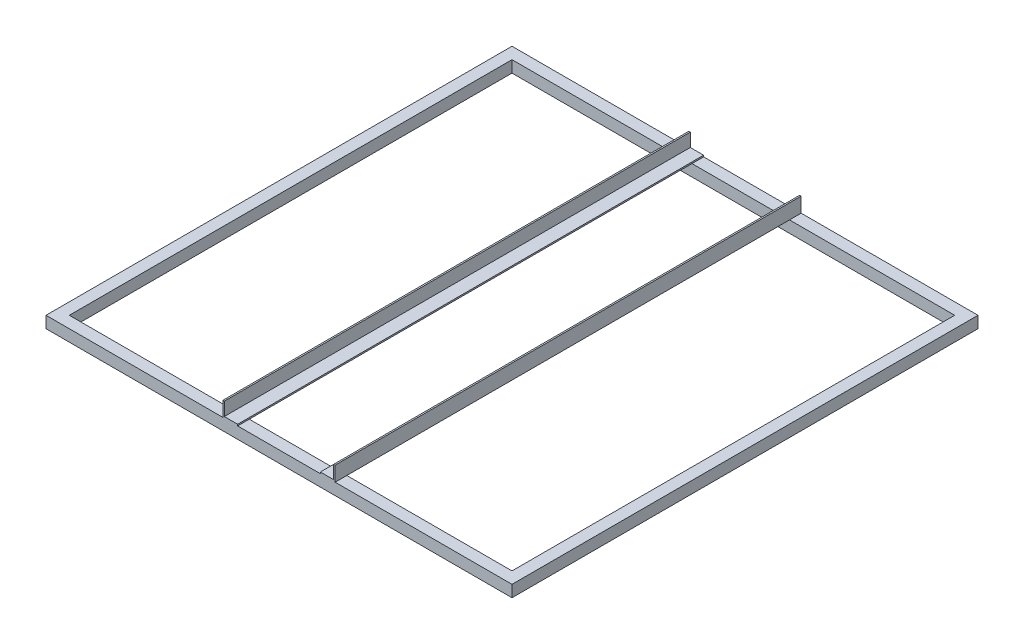
ISO-10303-21;
HEADER;
FILE_DESCRIPTION(('STEP AP214'),'2;1');
FILE_NAME('part.step','',(''),(''),'','','');
FILE_SCHEMA(('AUTOMOTIVE_DESIGN { 1 0 10303 214 1 1 1 1 }'));
ENDSEC;
DATA;
#1=APPLICATION_CONTEXT('core data for automotive mechanical design processes');
#2=APPLICATION_PROTOCOL_DEFINITION('international standard','automotive_design',2000,#1);
#3=PRODUCT_CONTEXT('',#1,'mechanical');
#4=PRODUCT('Part','Part','',(#3));
#5=PRODUCT_RELATED_PRODUCT_CATEGORY('part','',(#4));
#6=PRODUCT_DEFINITION_FORMATION('','',#4);
#7=PRODUCT_DEFINITION_CONTEXT('part definition',#1,'design');
#8=PRODUCT_DEFINITION('design','',#6,#7);
#9=PRODUCT_DEFINITION_SHAPE('','',#8);
#10=(LENGTH_UNIT() NAMED_UNIT(*) SI_UNIT(.MILLI.,.METRE.));
#11=(NAMED_UNIT(*) PLANE_ANGLE_UNIT() SI_UNIT($,.RADIAN.));
#12=(NAMED_UNIT(*) SI_UNIT($,.STERADIAN.) SOLID_ANGLE_UNIT());
#13=UNCERTAINTY_MEASURE_WITH_UNIT(LENGTH_MEASURE(1.E-05),#10,'distance_accuracy_value','');
#14=(GEOMETRIC_REPRESENTATION_CONTEXT(3) GLOBAL_UNCERTAINTY_ASSIGNED_CONTEXT((#13)) GLOBAL_UNIT_ASSIGNED_CONTEXT((#10,
#11,#12)) REPRESENTATION_CONTEXT('',''));
#15=CARTESIAN_POINT('',(0.,0.,0.));
#16=DIRECTION('',(0.,0.,1.));
#17=DIRECTION('',(1.,0.,0.));
#18=AXIS2_PLACEMENT_3D('',#15,#16,#17);
#19=CARTESIAN_POINT('',(0.,22.5,0.));
#20=DIRECTION('',(0.,-1.,0.));
#21=DIRECTION('',(0.,0.,-1.));
#22=AXIS2_PLACEMENT_3D('',#19,#20,#21);
#23=PLANE('',#22);
#24=DIRECTION('',(0.,0.,1.));
#25=VECTOR('',#24,1.);
#26=CARTESIAN_POINT('',(93.9,22.5,400.));
#27=LINE('',#26,#25);
#28=CARTESIAN_POINT('',(93.9,22.5,-400.));
#29=VERTEX_POINT('',#28);
#30=CARTESIAN_POINT('',(93.9,22.5,400.));
#31=VERTEX_POINT('',#30);
#32=EDGE_CURVE('E51',#29,#31,#27,.T.);
#33=ORIENTED_EDGE('',*,*,#32,.F.);
#34=DIRECTION('',(-1.,0.,0.));
#35=VECTOR('',#34,1.);
#36=CARTESIAN_POINT('',(71.,22.5,-400.));
#37=LINE('',#36,#35);
#38=CARTESIAN_POINT('',(71.,22.5,-400.));
#39=VERTEX_POINT('',#38);
#40=EDGE_CURVE('E254',#29,#39,#37,.T.);
#41=ORIENTED_EDGE('',*,*,#40,.T.);
#42=DIRECTION('',(0.,0.,1.));
#43=VECTOR('',#42,1.);
#44=CARTESIAN_POINT('',(71.,22.5,400.));
#45=LINE('',#44,#43);
#46=CARTESIAN_POINT('',(71.,22.5,400.));
#47=VERTEX_POINT('',#46);
#48=EDGE_CURVE('E250',#39,#47,#45,.T.);
#49=ORIENTED_EDGE('',*,*,#48,.T.);
#50=DIRECTION('',(1.,0.,0.));
#51=VECTOR('',#50,1.);
#52=CARTESIAN_POINT('',(71.,22.5,400.));
#53=LINE('',#52,#51);
#54=EDGE_CURVE('E56',#47,#31,#53,.T.);
#55=ORIENTED_EDGE('',*,*,#54,.T.);
#56=EDGE_LOOP('',(#33,#41,#49,#55));
#57=FACE_BOUND('',#56,.T.);
#58=ADVANCED_FACE('F33',(#57),#23,.F.);
#59=CARTESIAN_POINT('',(0.,22.5,0.));
#60=DIRECTION('',(0.,1.,0.));
#61=DIRECTION('',(0.,0.,1.));
#62=AXIS2_PLACEMENT_3D('',#59,#60,#61);
#63=PLANE('',#62);
#64=DIRECTION('',(-1.,0.,0.));
#65=VECTOR('',#64,1.);
#66=CARTESIAN_POINT('',(-71.,22.5,-400.));
#67=LINE('',#66,#65);
#68=CARTESIAN_POINT('',(-71.,22.5,-400.));
#69=VERTEX_POINT('',#68);
#70=CARTESIAN_POINT('',(-93.9,22.5,-400.));
#71=VERTEX_POINT('',#70);
#72=EDGE_CURVE('E272',#69,#71,#67,.T.);
#73=ORIENTED_EDGE('',*,*,#72,.T.);
#74=DIRECTION('',(0.,0.,-1.));
#75=VECTOR('',#74,1.);
#76=CARTESIAN_POINT('',(-93.9,22.5,-400.));
#77=LINE('',#76,#75);
#78=CARTESIAN_POINT('',(-93.8999999999999,22.5,400.));
#79=VERTEX_POINT('',#78);
#80=EDGE_CURVE('E230',#79,#71,#77,.T.);
#81=ORIENTED_EDGE('',*,*,#80,.F.);
#82=DIRECTION('',(1.,0.,0.));
#83=VECTOR('',#82,1.);
#84=CARTESIAN_POINT('',(-71.,22.5,400.));
#85=LINE('',#84,#83);
#86=CARTESIAN_POINT('',(-71.,22.5,400.));
#87=VERTEX_POINT('',#86);
#88=EDGE_CURVE('E275',#79,#87,#85,.T.);
#89=ORIENTED_EDGE('',*,*,#88,.T.);
#90=DIRECTION('',(0.,0.,-1.));
#91=VECTOR('',#90,1.);
#92=CARTESIAN_POINT('',(-71.,22.5,400.));
#93=LINE('',#92,#91);
#94=EDGE_CURVE('E269',#87,#69,#93,.T.);
#95=ORIENTED_EDGE('',*,*,#94,.T.);
#96=EDGE_LOOP('',(#73,#81,#89,#95));
#97=FACE_BOUND('',#96,.T.);
#98=ADVANCED_FACE('F446',(#97),#63,.T.);
#99=CARTESIAN_POINT('',(0.,20.,0.));
#100=DIRECTION('',(0.,1.,0.));
#101=DIRECTION('',(0.,0.,1.));
#102=AXIS2_PLACEMENT_3D('',#99,#100,#101);
#103=PLANE('',#102);
#104=DIRECTION('',(1.,0.,0.));
#105=VECTOR('',#104,1.);
#106=CARTESIAN_POINT('',(-400.,20.,400.));
#107=LINE('',#106,#105);
#108=CARTESIAN_POINT('',(-71.,20.,400.));
#109=VERTEX_POINT('',#108);
#110=CARTESIAN_POINT('',(71.,20.,400.));
#111=VERTEX_POINT('',#110);
#112=EDGE_CURVE('E312',#109,#111,#107,.T.);
#113=ORIENTED_EDGE('',*,*,#112,.T.);
#114=DIRECTION('',(0.,0.,1.));
#115=VECTOR('',#114,1.);
#116=CARTESIAN_POINT('',(71.,20.,400.));
#117=LINE('',#116,#115);
#118=CARTESIAN_POINT('',(71.,20.,380.));
#119=VERTEX_POINT('',#118);
#120=EDGE_CURVE('E249',#119,#111,#117,.T.);
#121=ORIENTED_EDGE('',*,*,#120,.F.);
#122=DIRECTION('',(1.,0.,0.));
#123=VECTOR('',#122,1.);
#124=CARTESIAN_POINT('',(380.,20.,380.));
#125=LINE('',#124,#123);
#126=CARTESIAN_POINT('',(-71.,20.,380.));
#127=VERTEX_POINT('',#126);
#128=EDGE_CURVE('E378',#127,#119,#125,.T.);
#129=ORIENTED_EDGE('',*,*,#128,.F.);
#130=DIRECTION('',(0.,0.,-1.));
#131=VECTOR('',#130,1.);
#132=CARTESIAN_POINT('',(-71.,20.,400.));
#133=LINE('',#132,#131);
#134=EDGE_CURVE('E281',#109,#127,#133,.T.);
#135=ORIENTED_EDGE('',*,*,#134,.F.);
#136=EDGE_LOOP('',(#113,#121,#129,#135));
#137=FACE_BOUND('',#136,.T.);
#138=ADVANCED_FACE('F401',(#137),#103,.T.);
#139=DIRECTION('',(-1.,0.,0.));
#140=VECTOR('',#139,1.);
#141=CARTESIAN_POINT('',(380.,20.,-380.));
#142=LINE('',#141,#140);
#143=CARTESIAN_POINT('',(71.,20.,-380.));
#144=VERTEX_POINT('',#143);
#145=CARTESIAN_POINT('',(-71.,20.,-380.));
#146=VERTEX_POINT('',#145);
#147=EDGE_CURVE('E364',#144,#146,#142,.T.);
#148=ORIENTED_EDGE('',*,*,#147,.F.);
#149=CARTESIAN_POINT('',(71.,20.,-400.));
#150=VERTEX_POINT('',#149);
#151=EDGE_CURVE('E256',#150,#144,#117,.T.);
#152=ORIENTED_EDGE('',*,*,#151,.F.);
#153=DIRECTION('',(-1.,0.,0.));
#154=VECTOR('',#153,1.);
#155=CARTESIAN_POINT('',(-400.,20.,-400.));
#156=LINE('',#155,#154);
#157=CARTESIAN_POINT('',(-71.,20.,-400.));
#158=VERTEX_POINT('',#157);
#159=EDGE_CURVE('E37',#150,#158,#156,.T.);
#160=ORIENTED_EDGE('',*,*,#159,.T.);
#161=EDGE_CURVE('E11',#146,#158,#133,.T.);
#162=ORIENTED_EDGE('',*,*,#161,.F.);
#163=EDGE_LOOP('',(#148,#152,#160,#162));
#164=FACE_BOUND('',#163,.T.);
#165=ADVANCED_FACE('F420',(#164),#103,.T.);
#166=CARTESIAN_POINT('',(400.,20.,-400.));
#167=VERTEX_POINT('',#166);
#168=CARTESIAN_POINT('',(96.4,20.,-400.));
#169=VERTEX_POINT('',#168);
#170=EDGE_CURVE('E329',#167,#169,#156,.T.);
#171=ORIENTED_EDGE('',*,*,#170,.T.);
#172=DIRECTION('',(0.,0.,-1.));
#173=VECTOR('',#172,1.);
#174=CARTESIAN_POINT('',(96.4,20.,400.));
#175=LINE('',#174,#173);
#176=CARTESIAN_POINT('',(96.4,20.,-380.));
#177=VERTEX_POINT('',#176);
#178=EDGE_CURVE('E202',#177,#169,#175,.T.);
#179=ORIENTED_EDGE('',*,*,#178,.F.);
#180=CARTESIAN_POINT('',(380.,20.,-380.));
#181=VERTEX_POINT('',#180);
#182=EDGE_CURVE('E348',#181,#177,#142,.T.);
#183=ORIENTED_EDGE('',*,*,#182,.F.);
#184=DIRECTION('',(0.,0.,-1.));
#185=VECTOR('',#184,1.);
#186=CARTESIAN_POINT('',(380.,20.,-380.));
#187=LINE('',#186,#185);
#188=CARTESIAN_POINT('',(380.,20.,380.));
#189=VERTEX_POINT('',#188);
#190=EDGE_CURVE('E366',#189,#181,#187,.T.);
#191=ORIENTED_EDGE('',*,*,#190,.F.);
#192=CARTESIAN_POINT('',(96.4,20.,380.));
#193=VERTEX_POINT('',#192);
#194=EDGE_CURVE('E373',#193,#189,#125,.T.);
#195=ORIENTED_EDGE('',*,*,#194,.F.);
#196=CARTESIAN_POINT('',(96.4,20.,400.));
#197=VERTEX_POINT('',#196);
#198=EDGE_CURVE('E252',#197,#193,#175,.T.);
#199=ORIENTED_EDGE('',*,*,#198,.F.);
#200=CARTESIAN_POINT('',(400.,20.,400.));
#201=VERTEX_POINT('',#200);
#202=EDGE_CURVE('E310',#197,#201,#107,.T.);
#203=ORIENTED_EDGE('',*,*,#202,.T.);
#204=DIRECTION('',(0.,0.,-1.));
#205=VECTOR('',#204,1.);
#206=CARTESIAN_POINT('',(400.,20.,-400.));
#207=LINE('',#206,#205);
#208=EDGE_CURVE('E328',#201,#167,#207,.T.);
#209=ORIENTED_EDGE('',*,*,#208,.T.);
#210=EDGE_LOOP('',(#171,#179,#183,#191,#195,#199,#203,#209));
#211=FACE_BOUND('',#210,.T.);
#212=ADVANCED_FACE('F480',(#211),#103,.T.);
#213=DIRECTION('',(0.,0.,1.));
#214=VECTOR('',#213,1.);
#215=CARTESIAN_POINT('',(-96.4,20.,400.));
#216=LINE('',#215,#214);
#217=CARTESIAN_POINT('',(-96.4,20.,-400.));
#218=VERTEX_POINT('',#217);
#219=CARTESIAN_POINT('',(-96.4,20.,-380.));
#220=VERTEX_POINT('',#219);
#221=EDGE_CURVE('E273',#218,#220,#216,.T.);
#222=ORIENTED_EDGE('',*,*,#221,.F.);
#223=CARTESIAN_POINT('',(-400.,20.,-400.));
#224=VERTEX_POINT('',#223);
#225=EDGE_CURVE('E326',#218,#224,#156,.T.);
#226=ORIENTED_EDGE('',*,*,#225,.T.);
#227=DIRECTION('',(0.,0.,1.));
#228=VECTOR('',#227,1.);
#229=CARTESIAN_POINT('',(-400.,20.,-400.));
#230=LINE('',#229,#228);
#231=CARTESIAN_POINT('',(-400.,20.,400.));
#232=VERTEX_POINT('',#231);
#233=EDGE_CURVE('E313',#224,#232,#230,.T.);
#234=ORIENTED_EDGE('',*,*,#233,.T.);
#235=CARTESIAN_POINT('',(-96.4,20.,400.));
#236=VERTEX_POINT('',#235);
#237=EDGE_CURVE('E323',#232,#236,#107,.T.);
#238=ORIENTED_EDGE('',*,*,#237,.T.);
#239=CARTESIAN_POINT('',(-96.4,20.,380.));
#240=VERTEX_POINT('',#239);
#241=EDGE_CURVE('E43',#240,#236,#216,.T.);
#242=ORIENTED_EDGE('',*,*,#241,.F.);
#243=CARTESIAN_POINT('',(-380.,20.,380.));
#244=VERTEX_POINT('',#243);
#245=EDGE_CURVE('E370',#244,#240,#125,.T.);
#246=ORIENTED_EDGE('',*,*,#245,.F.);
#247=DIRECTION('',(0.,0.,1.));
#248=VECTOR('',#247,1.);
#249=CARTESIAN_POINT('',(-380.,20.,-380.));
#250=LINE('',#249,#248);
#251=CARTESIAN_POINT('',(-380.,20.,-380.));
#252=VERTEX_POINT('',#251);
#253=EDGE_CURVE('E352',#252,#244,#250,.T.);
#254=ORIENTED_EDGE('',*,*,#253,.F.);
#255=EDGE_CURVE('E369',#220,#252,#142,.T.);
#256=ORIENTED_EDGE('',*,*,#255,.F.);
#257=EDGE_LOOP('',(#222,#226,#234,#238,#242,#246,#254,#256));
#258=FACE_BOUND('',#257,.T.);
#259=ADVANCED_FACE('F428',(#258),#103,.T.);
#260=CARTESIAN_POINT('',(0.,0.,0.));
#261=DIRECTION('',(0.,1.,0.));
#262=DIRECTION('',(0.,0.,1.));
#263=AXIS2_PLACEMENT_3D('',#260,#261,#262);
#264=PLANE('',#263);
#265=DIRECTION('',(0.,0.,-1.));
#266=VECTOR('',#265,1.);
#267=CARTESIAN_POINT('',(400.,0.,-400.));
#268=LINE('',#267,#266);
#269=CARTESIAN_POINT('',(400.,0.,400.));
#270=VERTEX_POINT('',#269);
#271=CARTESIAN_POINT('',(400.,0.,-400.));
#272=VERTEX_POINT('',#271);
#273=EDGE_CURVE('E317',#270,#272,#268,.T.);
#274=ORIENTED_EDGE('',*,*,#273,.F.);
#275=DIRECTION('',(1.,0.,0.));
#276=VECTOR('',#275,1.);
#277=CARTESIAN_POINT('',(-400.,0.,400.));
#278=LINE('',#277,#276);
#279=CARTESIAN_POINT('',(-400.,0.,400.));
#280=VERTEX_POINT('',#279);
#281=EDGE_CURVE('E337',#280,#270,#278,.T.);
#282=ORIENTED_EDGE('',*,*,#281,.F.);
#283=DIRECTION('',(0.,0.,1.));
#284=VECTOR('',#283,1.);
#285=CARTESIAN_POINT('',(-400.,0.,-400.));
#286=LINE('',#285,#284);
#287=CARTESIAN_POINT('',(-400.,0.,-400.));
#288=VERTEX_POINT('',#287);
#289=EDGE_CURVE('E463',#288,#280,#286,.T.);
#290=ORIENTED_EDGE('',*,*,#289,.F.);
#291=DIRECTION('',(-1.,0.,0.));
#292=VECTOR('',#291,1.);
#293=CARTESIAN_POINT('',(-400.,0.,-400.));
#294=LINE('',#293,#292);
#295=EDGE_CURVE('E464',#272,#288,#294,.T.);
#296=ORIENTED_EDGE('',*,*,#295,.F.);
#297=EDGE_LOOP('',(#274,#282,#290,#296));
#298=FACE_BOUND('',#297,.T.);
#299=DIRECTION('',(0.,0.,1.));
#300=VECTOR('',#299,1.);
#301=CARTESIAN_POINT('',(-380.,0.,-380.));
#302=LINE('',#301,#300);
#303=CARTESIAN_POINT('',(-380.,0.,-380.));
#304=VERTEX_POINT('',#303);
#305=CARTESIAN_POINT('',(-380.,0.,380.));
#306=VERTEX_POINT('',#305);
#307=EDGE_CURVE('E308',#304,#306,#302,.T.);
#308=ORIENTED_EDGE('',*,*,#307,.T.);
#309=DIRECTION('',(1.,0.,0.));
#310=VECTOR('',#309,1.);
#311=CARTESIAN_POINT('',(380.,0.,380.));
#312=LINE('',#311,#310);
#313=CARTESIAN_POINT('',(380.,0.,380.));
#314=VERTEX_POINT('',#313);
#315=EDGE_CURVE('E356',#306,#314,#312,.T.);
#316=ORIENTED_EDGE('',*,*,#315,.T.);
#317=DIRECTION('',(0.,0.,-1.));
#318=VECTOR('',#317,1.);
#319=CARTESIAN_POINT('',(380.,0.,-380.));
#320=LINE('',#319,#318);
#321=CARTESIAN_POINT('',(380.,0.,-380.));
#322=VERTEX_POINT('',#321);
#323=EDGE_CURVE('E353',#314,#322,#320,.T.);
#324=ORIENTED_EDGE('',*,*,#323,.T.);
#325=DIRECTION('',(-1.,0.,0.));
#326=VECTOR('',#325,1.);
#327=CARTESIAN_POINT('',(380.,0.,-380.));
#328=LINE('',#327,#326);
#329=EDGE_CURVE('E349',#322,#304,#328,.T.);
#330=ORIENTED_EDGE('',*,*,#329,.T.);
#331=EDGE_LOOP('',(#308,#316,#324,#330));
#332=FACE_BOUND('',#331,.T.);
#333=ADVANCED_FACE('F471',(#298,#332),#264,.F.);
#334=CARTESIAN_POINT('',(400.,20.,-400.));
#335=DIRECTION('',(-1.,0.,0.));
#336=DIRECTION('',(0.,0.,1.));
#337=AXIS2_PLACEMENT_3D('',#334,#335,#336);
#338=PLANE('',#337);
#339=ORIENTED_EDGE('',*,*,#273,.T.);
#340=DIRECTION('',(0.,-1.,0.));
#341=VECTOR('',#340,1.);
#342=CARTESIAN_POINT('',(400.,20.,-400.));
#343=LINE('',#342,#341);
#344=EDGE_CURVE('E450',#167,#272,#343,.T.);
#345=ORIENTED_EDGE('',*,*,#344,.F.);
#346=ORIENTED_EDGE('',*,*,#208,.F.);
#347=DIRECTION('',(0.,-1.,0.));
#348=VECTOR('',#347,1.);
#349=CARTESIAN_POINT('',(400.,20.,400.));
#350=LINE('',#349,#348);
#351=EDGE_CURVE('E325',#201,#270,#350,.T.);
#352=ORIENTED_EDGE('',*,*,#351,.T.);
#353=EDGE_LOOP('',(#339,#345,#346,#352));
#354=FACE_BOUND('',#353,.T.);
#355=ADVANCED_FACE('F35',(#354),#338,.F.);
#356=CARTESIAN_POINT('',(-400.,20.,-400.));
#357=DIRECTION('',(0.,0.,1.));
#358=DIRECTION('',(1.,0.,0.));
#359=AXIS2_PLACEMENT_3D('',#356,#357,#358);
#360=PLANE('',#359);
#361=ORIENTED_EDGE('',*,*,#295,.T.);
#362=DIRECTION('',(0.,-1.,0.));
#363=VECTOR('',#362,1.);
#364=CARTESIAN_POINT('',(-400.,20.,-400.));
#365=LINE('',#364,#363);
#366=EDGE_CURVE('E452',#224,#288,#365,.T.);
#367=ORIENTED_EDGE('',*,*,#366,.F.);
#368=ORIENTED_EDGE('',*,*,#225,.F.);
#369=DIRECTION('',(0.,-1.,0.));
#370=VECTOR('',#369,1.);
#371=CARTESIAN_POINT('',(-96.4,22.5,-400.));
#372=LINE('',#371,#370);
#373=CARTESIAN_POINT('',(-96.4,45.4,-400.));
#374=VERTEX_POINT('',#373);
#375=EDGE_CURVE('E300',#374,#218,#372,.T.);
#376=ORIENTED_EDGE('',*,*,#375,.F.);
#377=DIRECTION('',(-1.,0.,0.));
#378=VECTOR('',#377,1.);
#379=CARTESIAN_POINT('',(-96.4,45.4,-400.));
#380=LINE('',#379,#378);
#381=CARTESIAN_POINT('',(-93.9,45.4,-400.));
#382=VERTEX_POINT('',#381);
#383=EDGE_CURVE('E238',#382,#374,#380,.T.);
#384=ORIENTED_EDGE('',*,*,#383,.F.);
#385=DIRECTION('',(0.,-1.,0.));
#386=VECTOR('',#385,1.);
#387=CARTESIAN_POINT('',(-93.9,45.4,-400.));
#388=LINE('',#387,#386);
#389=EDGE_CURVE('E241',#382,#71,#388,.T.);
#390=ORIENTED_EDGE('',*,*,#389,.T.);
#391=ORIENTED_EDGE('',*,*,#72,.F.);
#392=DIRECTION('',(0.,-1.,0.));
#393=VECTOR('',#392,1.);
#394=CARTESIAN_POINT('',(-71.,22.5,-400.));
#395=LINE('',#394,#393);
#396=EDGE_CURVE('E303',#69,#158,#395,.T.);
#397=ORIENTED_EDGE('',*,*,#396,.T.);
#398=ORIENTED_EDGE('',*,*,#159,.F.);
#399=DIRECTION('',(0.,-1.,0.));
#400=VECTOR('',#399,1.);
#401=CARTESIAN_POINT('',(71.,22.5,-400.));
#402=LINE('',#401,#400);
#403=EDGE_CURVE('E206',#39,#150,#402,.T.);
#404=ORIENTED_EDGE('',*,*,#403,.F.);
#405=ORIENTED_EDGE('',*,*,#40,.F.);
#406=DIRECTION('',(0.,-1.,0.));
#407=VECTOR('',#406,1.);
#408=CARTESIAN_POINT('',(93.9,45.4,-400.));
#409=LINE('',#408,#407);
#410=CARTESIAN_POINT('',(93.9,45.4,-400.));
#411=VERTEX_POINT('',#410);
#412=EDGE_CURVE('E212',#411,#29,#409,.T.);
#413=ORIENTED_EDGE('',*,*,#412,.F.);
#414=DIRECTION('',(-1.,0.,0.));
#415=VECTOR('',#414,1.);
#416=CARTESIAN_POINT('',(96.4,45.4,-400.));
#417=LINE('',#416,#415);
#418=CARTESIAN_POINT('',(96.4,45.4,-400.));
#419=VERTEX_POINT('',#418);
#420=EDGE_CURVE('E209',#419,#411,#417,.T.);
#421=ORIENTED_EDGE('',*,*,#420,.F.);
#422=DIRECTION('',(0.,-1.,0.));
#423=VECTOR('',#422,1.);
#424=CARTESIAN_POINT('',(96.4,22.5,-400.));
#425=LINE('',#424,#423);
#426=EDGE_CURVE('E195',#419,#169,#425,.T.);
#427=ORIENTED_EDGE('',*,*,#426,.T.);
#428=ORIENTED_EDGE('',*,*,#170,.F.);
#429=ORIENTED_EDGE('',*,*,#344,.T.);
#430=EDGE_LOOP('',(#361,#367,#368,#376,#384,#390,#391,#397,#398,#404,#405,#413,#421,#427,#428,#429));
#431=FACE_BOUND('',#430,.T.);
#432=ADVANCED_FACE('F210',(#431),#360,.F.);
#433=CARTESIAN_POINT('',(-400.,20.,-400.));
#434=DIRECTION('',(1.,0.,0.));
#435=DIRECTION('',(0.,0.,-1.));
#436=AXIS2_PLACEMENT_3D('',#433,#434,#435);
#437=PLANE('',#436);
#438=ORIENTED_EDGE('',*,*,#289,.T.);
#439=DIRECTION('',(0.,-1.,0.));
#440=VECTOR('',#439,1.);
#441=CARTESIAN_POINT('',(-400.,20.,400.));
#442=LINE('',#441,#440);
#443=EDGE_CURVE('E456',#232,#280,#442,.T.);
#444=ORIENTED_EDGE('',*,*,#443,.F.);
#445=ORIENTED_EDGE('',*,*,#233,.F.);
#446=ORIENTED_EDGE('',*,*,#366,.T.);
#447=EDGE_LOOP('',(#438,#444,#445,#446));
#448=FACE_BOUND('',#447,.T.);
#449=ADVANCED_FACE('F476',(#448),#437,.F.);
#450=CARTESIAN_POINT('',(-400.,20.,400.));
#451=DIRECTION('',(0.,0.,-1.));
#452=DIRECTION('',(-1.,0.,0.));
#453=AXIS2_PLACEMENT_3D('',#450,#451,#452);
#454=PLANE('',#453);
#455=ORIENTED_EDGE('',*,*,#281,.T.);
#456=ORIENTED_EDGE('',*,*,#351,.F.);
#457=ORIENTED_EDGE('',*,*,#202,.F.);
#458=DIRECTION('',(0.,-1.,0.));
#459=VECTOR('',#458,1.);
#460=CARTESIAN_POINT('',(96.4,22.5,400.));
#461=LINE('',#460,#459);
#462=CARTESIAN_POINT('',(96.4,45.4,400.));
#463=VERTEX_POINT('',#462);
#464=EDGE_CURVE('E205',#463,#197,#461,.T.);
#465=ORIENTED_EDGE('',*,*,#464,.F.);
#466=DIRECTION('',(1.,0.,0.));
#467=VECTOR('',#466,1.);
#468=CARTESIAN_POINT('',(96.4,45.4,400.));
#469=LINE('',#468,#467);
#470=CARTESIAN_POINT('',(93.9,45.4,400.));
#471=VERTEX_POINT('',#470);
#472=EDGE_CURVE('E220',#471,#463,#469,.T.);
#473=ORIENTED_EDGE('',*,*,#472,.F.);
#474=DIRECTION('',(0.,-1.,0.));
#475=VECTOR('',#474,1.);
#476=CARTESIAN_POINT('',(93.9,45.4,400.));
#477=LINE('',#476,#475);
#478=EDGE_CURVE('E225',#471,#31,#477,.T.);
#479=ORIENTED_EDGE('',*,*,#478,.T.);
#480=ORIENTED_EDGE('',*,*,#54,.F.);
#481=DIRECTION('',(0.,-1.,0.));
#482=VECTOR('',#481,1.);
#483=CARTESIAN_POINT('',(71.,22.5,400.));
#484=LINE('',#483,#482);
#485=EDGE_CURVE('E263',#47,#111,#484,.T.);
#486=ORIENTED_EDGE('',*,*,#485,.T.);
#487=ORIENTED_EDGE('',*,*,#112,.F.);
#488=DIRECTION('',(0.,-1.,0.));
#489=VECTOR('',#488,1.);
#490=CARTESIAN_POINT('',(-71.,22.5,400.));
#491=LINE('',#490,#489);
#492=EDGE_CURVE('E277',#87,#109,#491,.T.);
#493=ORIENTED_EDGE('',*,*,#492,.F.);
#494=ORIENTED_EDGE('',*,*,#88,.F.);
#495=DIRECTION('',(0.,-1.,0.));
#496=VECTOR('',#495,1.);
#497=CARTESIAN_POINT('',(-93.8999999999999,45.4,400.));
#498=LINE('',#497,#496);
#499=CARTESIAN_POINT('',(-93.8999999999999,45.4,400.));
#500=VERTEX_POINT('',#499);
#501=EDGE_CURVE('E246',#500,#79,#498,.T.);
#502=ORIENTED_EDGE('',*,*,#501,.F.);
#503=DIRECTION('',(1.,0.,0.));
#504=VECTOR('',#503,1.);
#505=CARTESIAN_POINT('',(-96.4,45.4,400.));
#506=LINE('',#505,#504);
#507=CARTESIAN_POINT('',(-96.4,45.4,400.));
#508=VERTEX_POINT('',#507);
#509=EDGE_CURVE('E234',#508,#500,#506,.T.);
#510=ORIENTED_EDGE('',*,*,#509,.F.);
#511=DIRECTION('',(0.,-1.,0.));
#512=VECTOR('',#511,1.);
#513=CARTESIAN_POINT('',(-96.4,22.5,400.));
#514=LINE('',#513,#512);
#515=EDGE_CURVE('E295',#508,#236,#514,.T.);
#516=ORIENTED_EDGE('',*,*,#515,.T.);
#517=ORIENTED_EDGE('',*,*,#237,.F.);
#518=ORIENTED_EDGE('',*,*,#443,.T.);
#519=EDGE_LOOP('',(#455,#456,#457,#465,#473,#479,#480,#486,#487,#493,#494,#502,#510,#516,#517,#518));
#520=FACE_BOUND('',#519,.T.);
#521=ADVANCED_FACE('F404',(#520),#454,.F.);
#522=CARTESIAN_POINT('',(-380.,20.,-380.));
#523=DIRECTION('',(1.,0.,0.));
#524=DIRECTION('',(0.,0.,-1.));
#525=AXIS2_PLACEMENT_3D('',#522,#523,#524);
#526=PLANE('',#525);
#527=ORIENTED_EDGE('',*,*,#307,.F.);
#528=DIRECTION('',(0.,-1.,0.));
#529=VECTOR('',#528,1.);
#530=CARTESIAN_POINT('',(-380.,20.,-380.));
#531=LINE('',#530,#529);
#532=EDGE_CURVE('E345',#252,#304,#531,.T.);
#533=ORIENTED_EDGE('',*,*,#532,.F.);
#534=ORIENTED_EDGE('',*,*,#253,.T.);
#535=DIRECTION('',(0.,-1.,0.));
#536=VECTOR('',#535,1.);
#537=CARTESIAN_POINT('',(-380.,20.,380.));
#538=LINE('',#537,#536);
#539=EDGE_CURVE('E338',#244,#306,#538,.T.);
#540=ORIENTED_EDGE('',*,*,#539,.T.);
#541=EDGE_LOOP('',(#527,#533,#534,#540));
#542=FACE_BOUND('',#541,.T.);
#543=ADVANCED_FACE('F522',(#542),#526,.T.);
#544=CARTESIAN_POINT('',(380.,20.,380.));
#545=DIRECTION('',(0.,0.,-1.));
#546=DIRECTION('',(-1.,0.,0.));
#547=AXIS2_PLACEMENT_3D('',#544,#545,#546);
#548=PLANE('',#547);
#549=ORIENTED_EDGE('',*,*,#315,.F.);
#550=ORIENTED_EDGE('',*,*,#539,.F.);
#551=ORIENTED_EDGE('',*,*,#245,.T.);
#552=EDGE_CURVE('E372',#240,#127,#125,.T.);
#553=ORIENTED_EDGE('',*,*,#552,.T.);
#554=ORIENTED_EDGE('',*,*,#128,.T.);
#555=DIRECTION('',(-1.,0.,0.));
#556=VECTOR('',#555,1.);
#557=CARTESIAN_POINT('',(380.,20.,380.));
#558=LINE('',#557,#556);
#559=EDGE_CURVE('E266',#193,#119,#558,.T.);
#560=ORIENTED_EDGE('',*,*,#559,.F.);
#561=ORIENTED_EDGE('',*,*,#194,.T.);
#562=DIRECTION('',(0.,-1.,0.));
#563=VECTOR('',#562,1.);
#564=CARTESIAN_POINT('',(380.,20.,380.));
#565=LINE('',#564,#563);
#566=EDGE_CURVE('E341',#189,#314,#565,.T.);
#567=ORIENTED_EDGE('',*,*,#566,.T.);
#568=EDGE_LOOP('',(#549,#550,#551,#553,#554,#560,#561,#567));
#569=FACE_BOUND('',#568,.T.);
#570=ADVANCED_FACE('F387',(#569),#548,.T.);
#571=CARTESIAN_POINT('',(380.,20.,-380.));
#572=DIRECTION('',(-1.,0.,0.));
#573=DIRECTION('',(0.,0.,1.));
#574=AXIS2_PLACEMENT_3D('',#571,#572,#573);
#575=PLANE('',#574);
#576=ORIENTED_EDGE('',*,*,#323,.F.);
#577=ORIENTED_EDGE('',*,*,#566,.F.);
#578=ORIENTED_EDGE('',*,*,#190,.T.);
#579=DIRECTION('',(0.,-1.,0.));
#580=VECTOR('',#579,1.);
#581=CARTESIAN_POINT('',(380.,20.,-380.));
#582=LINE('',#581,#580);
#583=EDGE_CURVE('E343',#181,#322,#582,.T.);
#584=ORIENTED_EDGE('',*,*,#583,.T.);
#585=EDGE_LOOP('',(#576,#577,#578,#584));
#586=FACE_BOUND('',#585,.T.);
#587=ADVANCED_FACE('F516',(#586),#575,.T.);
#588=CARTESIAN_POINT('',(380.,20.,-380.));
#589=DIRECTION('',(0.,0.,1.));
#590=DIRECTION('',(1.,0.,0.));
#591=AXIS2_PLACEMENT_3D('',#588,#589,#590);
#592=PLANE('',#591);
#593=ORIENTED_EDGE('',*,*,#329,.F.);
#594=ORIENTED_EDGE('',*,*,#583,.F.);
#595=ORIENTED_EDGE('',*,*,#182,.T.);
#596=EDGE_CURVE('E363',#177,#144,#142,.T.);
#597=ORIENTED_EDGE('',*,*,#596,.T.);
#598=ORIENTED_EDGE('',*,*,#147,.T.);
#599=EDGE_CURVE('E365',#146,#220,#142,.T.);
#600=ORIENTED_EDGE('',*,*,#599,.T.);
#601=ORIENTED_EDGE('',*,*,#255,.T.);
#602=ORIENTED_EDGE('',*,*,#532,.T.);
#603=EDGE_LOOP('',(#593,#594,#595,#597,#598,#600,#601,#602));
#604=FACE_BOUND('',#603,.T.);
#605=ADVANCED_FACE('F424',(#604),#592,.T.);
#606=CARTESIAN_POINT('',(-71.,22.5,400.));
#607=DIRECTION('',(-1.,0.,0.));
#608=DIRECTION('',(0.,0.,1.));
#609=AXIS2_PLACEMENT_3D('',#606,#607,#608);
#610=PLANE('',#609);
#611=ORIENTED_EDGE('',*,*,#134,.T.);
#612=EDGE_CURVE('E268',#127,#146,#133,.T.);
#613=ORIENTED_EDGE('',*,*,#612,.T.);
#614=ORIENTED_EDGE('',*,*,#161,.T.);
#615=ORIENTED_EDGE('',*,*,#396,.F.);
#616=ORIENTED_EDGE('',*,*,#94,.F.);
#617=ORIENTED_EDGE('',*,*,#492,.T.);
#618=EDGE_LOOP('',(#611,#613,#614,#615,#616,#617));
#619=FACE_BOUND('',#618,.T.);
#620=ADVANCED_FACE('F395',(#619),#610,.F.);
#621=CARTESIAN_POINT('',(-96.4,22.5,400.));
#622=DIRECTION('',(1.,0.,0.));
#623=DIRECTION('',(0.,0.,-1.));
#624=AXIS2_PLACEMENT_3D('',#621,#622,#623);
#625=PLANE('',#624);
#626=ORIENTED_EDGE('',*,*,#221,.T.);
#627=EDGE_CURVE('E282',#220,#240,#216,.T.);
#628=ORIENTED_EDGE('',*,*,#627,.T.);
#629=ORIENTED_EDGE('',*,*,#241,.T.);
#630=ORIENTED_EDGE('',*,*,#515,.F.);
#631=DIRECTION('',(0.,0.,1.));
#632=VECTOR('',#631,1.);
#633=CARTESIAN_POINT('',(-96.4,45.4,-400.));
#634=LINE('',#633,#632);
#635=EDGE_CURVE('E231',#374,#508,#634,.T.);
#636=ORIENTED_EDGE('',*,*,#635,.F.);
#637=ORIENTED_EDGE('',*,*,#375,.T.);
#638=EDGE_LOOP('',(#626,#628,#629,#630,#636,#637));
#639=FACE_BOUND('',#638,.T.);
#640=ADVANCED_FACE('F432',(#639),#625,.F.);
#641=CARTESIAN_POINT('',(0.,20.,0.));
#642=DIRECTION('',(0.,1.,0.));
#643=DIRECTION('',(0.,0.,1.));
#644=AXIS2_PLACEMENT_3D('',#641,#642,#643);
#645=PLANE('',#644);
#646=ORIENTED_EDGE('',*,*,#552,.F.);
#647=ORIENTED_EDGE('',*,*,#627,.F.);
#648=ORIENTED_EDGE('',*,*,#599,.F.);
#649=ORIENTED_EDGE('',*,*,#612,.F.);
#650=EDGE_LOOP('',(#646,#647,#648,#649));
#651=FACE_BOUND('',#650,.T.);
#652=ADVANCED_FACE('F393',(#651),#645,.F.);
#653=CARTESIAN_POINT('',(71.,22.5,400.));
#654=DIRECTION('',(1.,0.,0.));
#655=DIRECTION('',(0.,0.,-1.));
#656=AXIS2_PLACEMENT_3D('',#653,#654,#655);
#657=PLANE('',#656);
#658=ORIENTED_EDGE('',*,*,#151,.T.);
#659=EDGE_CURVE('E258',#144,#119,#117,.T.);
#660=ORIENTED_EDGE('',*,*,#659,.T.);
#661=ORIENTED_EDGE('',*,*,#120,.T.);
#662=ORIENTED_EDGE('',*,*,#485,.F.);
#663=ORIENTED_EDGE('',*,*,#48,.F.);
#664=ORIENTED_EDGE('',*,*,#403,.T.);
#665=EDGE_LOOP('',(#658,#660,#661,#662,#663,#664));
#666=FACE_BOUND('',#665,.T.);
#667=ADVANCED_FACE('F409',(#666),#657,.F.);
#668=CARTESIAN_POINT('',(96.4,22.5,400.));
#669=DIRECTION('',(-1.,0.,0.));
#670=DIRECTION('',(0.,0.,1.));
#671=AXIS2_PLACEMENT_3D('',#668,#669,#670);
#672=PLANE('',#671);
#673=ORIENTED_EDGE('',*,*,#198,.T.);
#674=EDGE_CURVE('E260',#193,#177,#175,.T.);
#675=ORIENTED_EDGE('',*,*,#674,.T.);
#676=ORIENTED_EDGE('',*,*,#178,.T.);
#677=ORIENTED_EDGE('',*,*,#426,.F.);
#678=DIRECTION('',(0.,0.,-1.));
#679=VECTOR('',#678,1.);
#680=CARTESIAN_POINT('',(96.4,45.4,400.));
#681=LINE('',#680,#679);
#682=EDGE_CURVE('E199',#463,#419,#681,.T.);
#683=ORIENTED_EDGE('',*,*,#682,.F.);
#684=ORIENTED_EDGE('',*,*,#464,.T.);
#685=EDGE_LOOP('',(#673,#675,#676,#677,#683,#684));
#686=FACE_BOUND('',#685,.T.);
#687=ADVANCED_FACE('F197',(#686),#672,.F.);
#688=CARTESIAN_POINT('',(0.,20.,0.));
#689=DIRECTION('',(0.,-1.,0.));
#690=DIRECTION('',(0.,0.,-1.));
#691=AXIS2_PLACEMENT_3D('',#688,#689,#690);
#692=PLANE('',#691);
#693=ORIENTED_EDGE('',*,*,#674,.F.);
#694=ORIENTED_EDGE('',*,*,#559,.T.);
#695=ORIENTED_EDGE('',*,*,#659,.F.);
#696=ORIENTED_EDGE('',*,*,#596,.F.);
#697=EDGE_LOOP('',(#693,#694,#695,#696));
#698=FACE_BOUND('',#697,.T.);
#699=ADVANCED_FACE('F416',(#698),#692,.T.);
#700=CARTESIAN_POINT('',(-93.9,45.4,-400.));
#701=DIRECTION('',(-1.,0.,0.));
#702=DIRECTION('',(0.,0.,1.));
#703=AXIS2_PLACEMENT_3D('',#700,#701,#702);
#704=PLANE('',#703);
#705=ORIENTED_EDGE('',*,*,#80,.T.);
#706=ORIENTED_EDGE('',*,*,#389,.F.);
#707=DIRECTION('',(0.,0.,-1.));
#708=VECTOR('',#707,1.);
#709=CARTESIAN_POINT('',(-93.9,45.4,-400.));
#710=LINE('',#709,#708);
#711=EDGE_CURVE('E236',#500,#382,#710,.T.);
#712=ORIENTED_EDGE('',*,*,#711,.F.);
#713=ORIENTED_EDGE('',*,*,#501,.T.);
#714=EDGE_LOOP('',(#705,#706,#712,#713));
#715=FACE_BOUND('',#714,.T.);
#716=ADVANCED_FACE('F443',(#715),#704,.F.);
#717=CARTESIAN_POINT('',(0.,45.4,0.));
#718=DIRECTION('',(0.,1.,0.));
#719=DIRECTION('',(0.,0.,1.));
#720=AXIS2_PLACEMENT_3D('',#717,#718,#719);
#721=PLANE('',#720);
#722=ORIENTED_EDGE('',*,*,#635,.T.);
#723=ORIENTED_EDGE('',*,*,#509,.T.);
#724=ORIENTED_EDGE('',*,*,#711,.T.);
#725=ORIENTED_EDGE('',*,*,#383,.T.);
#726=EDGE_LOOP('',(#722,#723,#724,#725));
#727=FACE_BOUND('',#726,.T.);
#728=ADVANCED_FACE('F437',(#727),#721,.T.);
#729=CARTESIAN_POINT('',(93.9,45.4,400.));
#730=DIRECTION('',(1.,0.,0.));
#731=DIRECTION('',(0.,0.,-1.));
#732=AXIS2_PLACEMENT_3D('',#729,#730,#731);
#733=PLANE('',#732);
#734=ORIENTED_EDGE('',*,*,#32,.T.);
#735=ORIENTED_EDGE('',*,*,#478,.F.);
#736=DIRECTION('',(0.,0.,1.));
#737=VECTOR('',#736,1.);
#738=CARTESIAN_POINT('',(93.9,45.4,400.));
#739=LINE('',#738,#737);
#740=EDGE_CURVE('E215',#411,#471,#739,.T.);
#741=ORIENTED_EDGE('',*,*,#740,.F.);
#742=ORIENTED_EDGE('',*,*,#412,.T.);
#743=EDGE_LOOP('',(#734,#735,#741,#742));
#744=FACE_BOUND('',#743,.T.);
#745=ADVANCED_FACE('F485',(#744),#733,.F.);
#746=CARTESIAN_POINT('',(0.,45.4,0.));
#747=DIRECTION('',(0.,1.,0.));
#748=DIRECTION('',(0.,0.,1.));
#749=AXIS2_PLACEMENT_3D('',#746,#747,#748);
#750=PLANE('',#749);
#751=ORIENTED_EDGE('',*,*,#682,.T.);
#752=ORIENTED_EDGE('',*,*,#420,.T.);
#753=ORIENTED_EDGE('',*,*,#740,.T.);
#754=ORIENTED_EDGE('',*,*,#472,.T.);
#755=EDGE_LOOP('',(#751,#752,#753,#754));
#756=FACE_BOUND('',#755,.T.);
#757=ADVANCED_FACE('F218',(#756),#750,.T.);
#758=CLOSED_SHELL('',(#58,#98,#138,#165,#212,#259,#333,#355,#432,#449,#521,#543,#570,#587,#605,
#620,#640,#652,#667,#687,#699,#716,#728,#745,#757));
#759=MANIFOLD_SOLID_BREP('B2',#758);
#760=ADVANCED_BREP_SHAPE_REPRESENTATION('',(#18,#759),#14);
#761=SHAPE_DEFINITION_REPRESENTATION(#9,#760);
ENDSEC;
END-ISO-10303-21;
